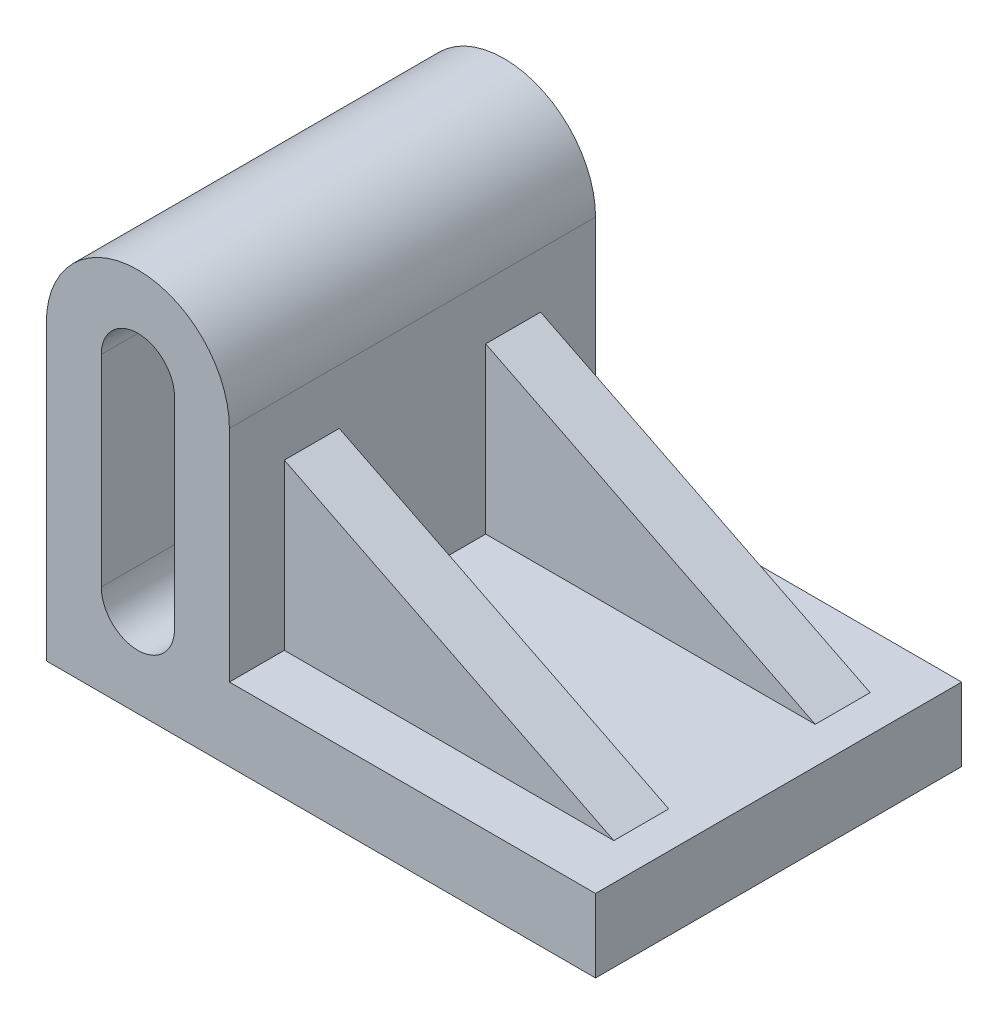
ISO-10303-21;
HEADER;
FILE_DESCRIPTION(('STEP AP214'),'2;1');
FILE_NAME('part.step','',(''),(''),'','','');
FILE_SCHEMA(('AUTOMOTIVE_DESIGN { 1 0 10303 214 1 1 1 1 }'));
ENDSEC;
DATA;
#1=APPLICATION_CONTEXT('core data for automotive mechanical design processes');
#2=APPLICATION_PROTOCOL_DEFINITION('international standard','automotive_design',2000,#1);
#3=PRODUCT_CONTEXT('',#1,'mechanical');
#4=PRODUCT('Part','Part','',(#3));
#5=PRODUCT_RELATED_PRODUCT_CATEGORY('part','',(#4));
#6=PRODUCT_DEFINITION_FORMATION('','',#4);
#7=PRODUCT_DEFINITION_CONTEXT('part definition',#1,'design');
#8=PRODUCT_DEFINITION('design','',#6,#7);
#9=PRODUCT_DEFINITION_SHAPE('','',#8);
#10=(LENGTH_UNIT() NAMED_UNIT(*) SI_UNIT(.MILLI.,.METRE.));
#11=(NAMED_UNIT(*) PLANE_ANGLE_UNIT() SI_UNIT($,.RADIAN.));
#12=(NAMED_UNIT(*) SI_UNIT($,.STERADIAN.) SOLID_ANGLE_UNIT());
#13=UNCERTAINTY_MEASURE_WITH_UNIT(LENGTH_MEASURE(1.E-05),#10,'distance_accuracy_value','');
#14=(GEOMETRIC_REPRESENTATION_CONTEXT(3) GLOBAL_UNCERTAINTY_ASSIGNED_CONTEXT((#13)) GLOBAL_UNIT_ASSIGNED_CONTEXT((#10,
#11,#12)) REPRESENTATION_CONTEXT('',''));
#15=CARTESIAN_POINT('',(0.,0.,0.));
#16=DIRECTION('',(0.,0.,1.));
#17=DIRECTION('',(1.,0.,0.));
#18=AXIS2_PLACEMENT_3D('',#15,#16,#17);
#19=CARTESIAN_POINT('',(25.,80.,50.));
#20=DIRECTION('',(0.,0.,-1.));
#21=DIRECTION('',(-1.,0.,0.));
#22=AXIS2_PLACEMENT_3D('',#19,#20,#21);
#23=CYLINDRICAL_SURFACE('',#22,25.);
#24=CARTESIAN_POINT('',(25.,80.,-50.));
#25=DIRECTION('',(0.,0.,1.));
#26=DIRECTION('',(1.,0.,0.));
#27=AXIS2_PLACEMENT_3D('',#24,#25,#26);
#28=CIRCLE('',#27,25.);
#29=CARTESIAN_POINT('',(0.,80.,-50.));
#30=VERTEX_POINT('',#29);
#31=CARTESIAN_POINT('',(50.,80.,-50.));
#32=VERTEX_POINT('',#31);
#33=EDGE_CURVE('E245',#30,#32,#28,.F.);
#34=ORIENTED_EDGE('',*,*,#33,.F.);
#35=DIRECTION('',(0.,0.,-1.));
#36=VECTOR('',#35,1.);
#37=CARTESIAN_POINT('',(0.,80.,50.));
#38=LINE('',#37,#36);
#39=CARTESIAN_POINT('',(0.,80.,50.));
#40=VERTEX_POINT('',#39);
#41=EDGE_CURVE('E11',#40,#30,#38,.T.);
#42=ORIENTED_EDGE('',*,*,#41,.F.);
#43=CARTESIAN_POINT('',(25.,80.,50.));
#44=DIRECTION('',(0.,0.,1.));
#45=DIRECTION('',(1.,0.,0.));
#46=AXIS2_PLACEMENT_3D('',#43,#44,#45);
#47=CIRCLE('',#46,25.);
#48=CARTESIAN_POINT('',(50.,80.,50.));
#49=VERTEX_POINT('',#48);
#50=EDGE_CURVE('E215',#40,#49,#47,.F.);
#51=ORIENTED_EDGE('',*,*,#50,.T.);
#52=DIRECTION('',(0.,0.,-1.));
#53=VECTOR('',#52,1.);
#54=CARTESIAN_POINT('',(50.,80.,50.));
#55=LINE('',#54,#53);
#56=EDGE_CURVE('E262',#49,#32,#55,.T.);
#57=ORIENTED_EDGE('',*,*,#56,.T.);
#58=EDGE_LOOP('',(#34,#42,#51,#57));
#59=FACE_BOUND('',#58,.T.);
#60=ADVANCED_FACE('F41',(#59),#23,.T.);
#61=CARTESIAN_POINT('',(0.,0.,50.));
#62=DIRECTION('',(-1.,0.,0.));
#63=DIRECTION('',(0.,0.,1.));
#64=AXIS2_PLACEMENT_3D('',#61,#62,#63);
#65=PLANE('',#64);
#66=DIRECTION('',(0.,1.,0.));
#67=VECTOR('',#66,1.);
#68=CARTESIAN_POINT('',(0.,0.,-50.));
#69=LINE('',#68,#67);
#70=CARTESIAN_POINT('',(0.,0.,-50.));
#71=VERTEX_POINT('',#70);
#72=EDGE_CURVE('E248',#71,#30,#69,.T.);
#73=ORIENTED_EDGE('',*,*,#72,.F.);
#74=DIRECTION('',(0.,0.,-1.));
#75=VECTOR('',#74,1.);
#76=CARTESIAN_POINT('',(0.,0.,50.));
#77=LINE('',#76,#75);
#78=CARTESIAN_POINT('',(0.,0.,50.));
#79=VERTEX_POINT('',#78);
#80=EDGE_CURVE('E50',#79,#71,#77,.T.);
#81=ORIENTED_EDGE('',*,*,#80,.F.);
#82=DIRECTION('',(0.,1.,0.));
#83=VECTOR('',#82,1.);
#84=CARTESIAN_POINT('',(0.,0.,50.));
#85=LINE('',#84,#83);
#86=EDGE_CURVE('E218',#79,#40,#85,.T.);
#87=ORIENTED_EDGE('',*,*,#86,.T.);
#88=ORIENTED_EDGE('',*,*,#41,.T.);
#89=EDGE_LOOP('',(#73,#81,#87,#88));
#90=FACE_BOUND('',#89,.T.);
#91=ADVANCED_FACE('F309',(#90),#65,.T.);
#92=CARTESIAN_POINT('',(0.,0.,50.));
#93=DIRECTION('',(0.,-1.,0.));
#94=DIRECTION('',(1.,0.,0.));
#95=AXIS2_PLACEMENT_3D('',#92,#93,#94);
#96=PLANE('',#95);
#97=DIRECTION('',(-1.,0.,0.));
#98=VECTOR('',#97,1.);
#99=CARTESIAN_POINT('',(0.,0.,-50.));
#100=LINE('',#99,#98);
#101=CARTESIAN_POINT('',(150.,0.,-50.));
#102=VERTEX_POINT('',#101);
#103=EDGE_CURVE('E251',#102,#71,#100,.T.);
#104=ORIENTED_EDGE('',*,*,#103,.F.);
#105=DIRECTION('',(0.,0.,-1.));
#106=VECTOR('',#105,1.);
#107=CARTESIAN_POINT('',(150.,0.,50.));
#108=LINE('',#107,#106);
#109=CARTESIAN_POINT('',(150.,0.,50.));
#110=VERTEX_POINT('',#109);
#111=EDGE_CURVE('E270',#110,#102,#108,.T.);
#112=ORIENTED_EDGE('',*,*,#111,.F.);
#113=DIRECTION('',(-1.,0.,0.));
#114=VECTOR('',#113,1.);
#115=CARTESIAN_POINT('',(0.,0.,50.));
#116=LINE('',#115,#114);
#117=EDGE_CURVE('E221',#110,#79,#116,.T.);
#118=ORIENTED_EDGE('',*,*,#117,.T.);
#119=ORIENTED_EDGE('',*,*,#80,.T.);
#120=EDGE_LOOP('',(#104,#112,#118,#119));
#121=FACE_BOUND('',#120,.T.);
#122=ADVANCED_FACE('F313',(#121),#96,.T.);
#123=CARTESIAN_POINT('',(150.,0.,50.));
#124=DIRECTION('',(1.,0.,0.));
#125=DIRECTION('',(0.,0.,-1.));
#126=AXIS2_PLACEMENT_3D('',#123,#124,#125);
#127=PLANE('',#126);
#128=DIRECTION('',(0.,-1.,0.));
#129=VECTOR('',#128,1.);
#130=CARTESIAN_POINT('',(150.,0.,-50.));
#131=LINE('',#130,#129);
#132=CARTESIAN_POINT('',(150.,20.,-50.));
#133=VERTEX_POINT('',#132);
#134=EDGE_CURVE('E254',#133,#102,#131,.T.);
#135=ORIENTED_EDGE('',*,*,#134,.F.);
#136=DIRECTION('',(0.,0.,-1.));
#137=VECTOR('',#136,1.);
#138=CARTESIAN_POINT('',(150.,20.,50.));
#139=LINE('',#138,#137);
#140=CARTESIAN_POINT('',(150.,20.,50.));
#141=VERTEX_POINT('',#140);
#142=EDGE_CURVE('E267',#141,#133,#139,.T.);
#143=ORIENTED_EDGE('',*,*,#142,.F.);
#144=DIRECTION('',(0.,-1.,0.));
#145=VECTOR('',#144,1.);
#146=CARTESIAN_POINT('',(150.,0.,50.));
#147=LINE('',#146,#145);
#148=EDGE_CURVE('E224',#141,#110,#147,.T.);
#149=ORIENTED_EDGE('',*,*,#148,.T.);
#150=ORIENTED_EDGE('',*,*,#111,.T.);
#151=EDGE_LOOP('',(#135,#143,#149,#150));
#152=FACE_BOUND('',#151,.T.);
#153=ADVANCED_FACE('F317',(#152),#127,.T.);
#154=CARTESIAN_POINT('',(0.,20.,50.));
#155=DIRECTION('',(0.,1.,0.));
#156=DIRECTION('',(0.,0.,1.));
#157=AXIS2_PLACEMENT_3D('',#154,#155,#156);
#158=PLANE('',#157);
#159=DIRECTION('',(1.,0.,0.));
#160=VECTOR('',#159,1.);
#161=CARTESIAN_POINT('',(0.,20.,-35.));
#162=LINE('',#161,#160);
#163=CARTESIAN_POINT('',(50.,20.,-35.));
#164=VERTEX_POINT('',#163);
#165=CARTESIAN_POINT('',(140.,20.,-35.));
#166=VERTEX_POINT('',#165);
#167=EDGE_CURVE('E159',#164,#166,#162,.T.);
#168=ORIENTED_EDGE('',*,*,#167,.T.);
#169=DIRECTION('',(0.,0.,1.));
#170=VECTOR('',#169,1.);
#171=CARTESIAN_POINT('',(140.,20.,-35.));
#172=LINE('',#171,#170);
#173=CARTESIAN_POINT('',(140.,20.,-20.));
#174=VERTEX_POINT('',#173);
#175=EDGE_CURVE('E167',#166,#174,#172,.T.);
#176=ORIENTED_EDGE('',*,*,#175,.T.);
#177=DIRECTION('',(1.,0.,0.));
#178=VECTOR('',#177,1.);
#179=CARTESIAN_POINT('',(0.,20.,-20.));
#180=LINE('',#179,#178);
#181=CARTESIAN_POINT('',(50.,20.,-20.));
#182=VERTEX_POINT('',#181);
#183=EDGE_CURVE('E182',#182,#174,#180,.T.);
#184=ORIENTED_EDGE('',*,*,#183,.F.);
#185=DIRECTION('',(0.,0.,-1.));
#186=VECTOR('',#185,1.);
#187=CARTESIAN_POINT('',(50.,20.,50.));
#188=LINE('',#187,#186);
#189=CARTESIAN_POINT('',(50.,20.,20.));
#190=VERTEX_POINT('',#189);
#191=EDGE_CURVE('E268',#190,#182,#188,.T.);
#192=ORIENTED_EDGE('',*,*,#191,.F.);
#193=DIRECTION('',(1.,0.,0.));
#194=VECTOR('',#193,1.);
#195=CARTESIAN_POINT('',(0.,20.,20.));
#196=LINE('',#195,#194);
#197=CARTESIAN_POINT('',(140.,20.,20.));
#198=VERTEX_POINT('',#197);
#199=EDGE_CURVE('E66',#190,#198,#196,.T.);
#200=ORIENTED_EDGE('',*,*,#199,.T.);
#201=DIRECTION('',(0.,0.,-1.));
#202=VECTOR('',#201,1.);
#203=CARTESIAN_POINT('',(140.,20.,35.));
#204=LINE('',#203,#202);
#205=CARTESIAN_POINT('',(140.,20.,35.));
#206=VERTEX_POINT('',#205);
#207=EDGE_CURVE('E193',#206,#198,#204,.T.);
#208=ORIENTED_EDGE('',*,*,#207,.F.);
#209=DIRECTION('',(1.,0.,0.));
#210=VECTOR('',#209,1.);
#211=CARTESIAN_POINT('',(0.,20.,35.));
#212=LINE('',#211,#210);
#213=CARTESIAN_POINT('',(50.,20.,35.));
#214=VERTEX_POINT('',#213);
#215=EDGE_CURVE('E191',#214,#206,#212,.T.);
#216=ORIENTED_EDGE('',*,*,#215,.F.);
#217=CARTESIAN_POINT('',(50.,20.,50.));
#218=VERTEX_POINT('',#217);
#219=EDGE_CURVE('E264',#218,#214,#188,.T.);
#220=ORIENTED_EDGE('',*,*,#219,.F.);
#221=DIRECTION('',(1.,0.,0.));
#222=VECTOR('',#221,1.);
#223=CARTESIAN_POINT('',(0.,20.,50.));
#224=LINE('',#223,#222);
#225=EDGE_CURVE('E227',#218,#141,#224,.T.);
#226=ORIENTED_EDGE('',*,*,#225,.T.);
#227=ORIENTED_EDGE('',*,*,#142,.T.);
#228=DIRECTION('',(1.,0.,0.));
#229=VECTOR('',#228,1.);
#230=CARTESIAN_POINT('',(0.,20.,-50.));
#231=LINE('',#230,#229);
#232=CARTESIAN_POINT('',(50.,20.,-50.));
#233=VERTEX_POINT('',#232);
#234=EDGE_CURVE('E257',#233,#133,#231,.T.);
#235=ORIENTED_EDGE('',*,*,#234,.F.);
#236=EDGE_CURVE('E177',#164,#233,#188,.T.);
#237=ORIENTED_EDGE('',*,*,#236,.F.);
#238=EDGE_LOOP('',(#168,#176,#184,#192,#200,#208,#216,#220,#226,#227,#235,#237));
#239=FACE_BOUND('',#238,.T.);
#240=ADVANCED_FACE('F175',(#239),#158,.T.);
#241=CARTESIAN_POINT('',(25.,25.,50.));
#242=DIRECTION('',(0.,0.,-1.));
#243=DIRECTION('',(-1.,0.,0.));
#244=AXIS2_PLACEMENT_3D('',#241,#242,#243);
#245=CYLINDRICAL_SURFACE('',#244,10.);
#246=CARTESIAN_POINT('',(25.,25.,-50.));
#247=DIRECTION('',(0.,0.,1.));
#248=DIRECTION('',(1.,0.,0.));
#249=AXIS2_PLACEMENT_3D('',#246,#247,#248);
#250=CIRCLE('',#249,10.);
#251=CARTESIAN_POINT('',(15.,25.,-50.));
#252=VERTEX_POINT('',#251);
#253=CARTESIAN_POINT('',(35.,25.,-50.));
#254=VERTEX_POINT('',#253);
#255=EDGE_CURVE('E202',#252,#254,#250,.T.);
#256=ORIENTED_EDGE('',*,*,#255,.F.);
#257=DIRECTION('',(0.,0.,-1.));
#258=VECTOR('',#257,1.);
#259=CARTESIAN_POINT('',(15.,25.,50.));
#260=LINE('',#259,#258);
#261=CARTESIAN_POINT('',(15.,25.,50.));
#262=VERTEX_POINT('',#261);
#263=EDGE_CURVE('E45',#262,#252,#260,.T.);
#264=ORIENTED_EDGE('',*,*,#263,.F.);
#265=CARTESIAN_POINT('',(25.,25.,50.));
#266=DIRECTION('',(0.,0.,1.));
#267=DIRECTION('',(1.,0.,0.));
#268=AXIS2_PLACEMENT_3D('',#265,#266,#267);
#269=CIRCLE('',#268,10.);
#270=CARTESIAN_POINT('',(35.,25.,50.));
#271=VERTEX_POINT('',#270);
#272=EDGE_CURVE('E203',#262,#271,#269,.T.);
#273=ORIENTED_EDGE('',*,*,#272,.T.);
#274=DIRECTION('',(0.,0.,-1.));
#275=VECTOR('',#274,1.);
#276=CARTESIAN_POINT('',(35.,25.,50.));
#277=LINE('',#276,#275);
#278=EDGE_CURVE('E233',#271,#254,#277,.T.);
#279=ORIENTED_EDGE('',*,*,#278,.T.);
#280=EDGE_LOOP('',(#256,#264,#273,#279));
#281=FACE_BOUND('',#280,.T.);
#282=ADVANCED_FACE('F43',(#281),#245,.F.);
#283=CARTESIAN_POINT('',(15.,0.,50.));
#284=DIRECTION('',(1.,0.,0.));
#285=DIRECTION('',(0.,0.,-1.));
#286=AXIS2_PLACEMENT_3D('',#283,#284,#285);
#287=PLANE('',#286);
#288=DIRECTION('',(0.,-1.,0.));
#289=VECTOR('',#288,1.);
#290=CARTESIAN_POINT('',(15.,0.,-50.));
#291=LINE('',#290,#289);
#292=CARTESIAN_POINT('',(15.,80.,-50.));
#293=VERTEX_POINT('',#292);
#294=EDGE_CURVE('E236',#293,#252,#291,.T.);
#295=ORIENTED_EDGE('',*,*,#294,.F.);
#296=DIRECTION('',(0.,0.,-1.));
#297=VECTOR('',#296,1.);
#298=CARTESIAN_POINT('',(15.,80.,50.));
#299=LINE('',#298,#297);
#300=CARTESIAN_POINT('',(15.,80.,50.));
#301=VERTEX_POINT('',#300);
#302=EDGE_CURVE('E275',#301,#293,#299,.T.);
#303=ORIENTED_EDGE('',*,*,#302,.F.);
#304=DIRECTION('',(0.,-1.,0.));
#305=VECTOR('',#304,1.);
#306=CARTESIAN_POINT('',(15.,0.,50.));
#307=LINE('',#306,#305);
#308=EDGE_CURVE('E206',#301,#262,#307,.T.);
#309=ORIENTED_EDGE('',*,*,#308,.T.);
#310=ORIENTED_EDGE('',*,*,#263,.T.);
#311=EDGE_LOOP('',(#295,#303,#309,#310));
#312=FACE_BOUND('',#311,.T.);
#313=ADVANCED_FACE('F281',(#312),#287,.T.);
#314=CARTESIAN_POINT('',(25.,80.,50.));
#315=DIRECTION('',(0.,0.,-1.));
#316=DIRECTION('',(-1.,0.,0.));
#317=AXIS2_PLACEMENT_3D('',#314,#315,#316);
#318=CYLINDRICAL_SURFACE('',#317,10.);
#319=CARTESIAN_POINT('',(25.,80.,-50.));
#320=DIRECTION('',(0.,0.,1.));
#321=DIRECTION('',(1.,0.,0.));
#322=AXIS2_PLACEMENT_3D('',#319,#320,#321);
#323=CIRCLE('',#322,10.);
#324=CARTESIAN_POINT('',(35.,80.,-50.));
#325=VERTEX_POINT('',#324);
#326=EDGE_CURVE('E239',#325,#293,#323,.T.);
#327=ORIENTED_EDGE('',*,*,#326,.F.);
#328=DIRECTION('',(0.,0.,-1.));
#329=VECTOR('',#328,1.);
#330=CARTESIAN_POINT('',(35.,80.,50.));
#331=LINE('',#330,#329);
#332=CARTESIAN_POINT('',(35.,80.,50.));
#333=VERTEX_POINT('',#332);
#334=EDGE_CURVE('E274',#333,#325,#331,.T.);
#335=ORIENTED_EDGE('',*,*,#334,.F.);
#336=CARTESIAN_POINT('',(25.,80.,50.));
#337=DIRECTION('',(0.,0.,1.));
#338=DIRECTION('',(1.,0.,0.));
#339=AXIS2_PLACEMENT_3D('',#336,#337,#338);
#340=CIRCLE('',#339,10.);
#341=EDGE_CURVE('E210',#333,#301,#340,.T.);
#342=ORIENTED_EDGE('',*,*,#341,.T.);
#343=ORIENTED_EDGE('',*,*,#302,.T.);
#344=EDGE_LOOP('',(#327,#335,#342,#343));
#345=FACE_BOUND('',#344,.T.);
#346=ADVANCED_FACE('F290',(#345),#318,.F.);
#347=CARTESIAN_POINT('',(35.,0.,50.));
#348=DIRECTION('',(1.,0.,0.));
#349=DIRECTION('',(0.,1.,0.));
#350=AXIS2_PLACEMENT_3D('',#347,#348,#349);
#351=PLANE('',#350);
#352=DIRECTION('',(0.,-1.,0.));
#353=VECTOR('',#352,1.);
#354=CARTESIAN_POINT('',(35.,0.,-50.));
#355=LINE('',#354,#353);
#356=EDGE_CURVE('E242',#325,#254,#355,.T.);
#357=ORIENTED_EDGE('',*,*,#356,.T.);
#358=ORIENTED_EDGE('',*,*,#278,.F.);
#359=DIRECTION('',(0.,-1.,0.));
#360=VECTOR('',#359,1.);
#361=CARTESIAN_POINT('',(35.,0.,50.));
#362=LINE('',#361,#360);
#363=EDGE_CURVE('E213',#333,#271,#362,.T.);
#364=ORIENTED_EDGE('',*,*,#363,.F.);
#365=ORIENTED_EDGE('',*,*,#334,.T.);
#366=EDGE_LOOP('',(#357,#358,#364,#365));
#367=FACE_BOUND('',#366,.T.);
#368=ADVANCED_FACE('F294',(#367),#351,.F.);
#369=CARTESIAN_POINT('',(50.,0.,50.));
#370=DIRECTION('',(1.,0.,0.));
#371=DIRECTION('',(0.,1.,0.));
#372=AXIS2_PLACEMENT_3D('',#369,#370,#371);
#373=PLANE('',#372);
#374=DIRECTION('',(0.,-1.,0.));
#375=VECTOR('',#374,1.);
#376=CARTESIAN_POINT('',(50.,0.,-35.));
#377=LINE('',#376,#375);
#378=CARTESIAN_POINT('',(50.,65.,-35.));
#379=VERTEX_POINT('',#378);
#380=EDGE_CURVE('E161',#379,#164,#377,.T.);
#381=ORIENTED_EDGE('',*,*,#380,.T.);
#382=ORIENTED_EDGE('',*,*,#236,.T.);
#383=DIRECTION('',(0.,-1.,0.));
#384=VECTOR('',#383,1.);
#385=CARTESIAN_POINT('',(50.,0.,-50.));
#386=LINE('',#385,#384);
#387=EDGE_CURVE('E207',#32,#233,#386,.T.);
#388=ORIENTED_EDGE('',*,*,#387,.F.);
#389=ORIENTED_EDGE('',*,*,#56,.F.);
#390=DIRECTION('',(0.,-1.,0.));
#391=VECTOR('',#390,1.);
#392=CARTESIAN_POINT('',(50.,0.,50.));
#393=LINE('',#392,#391);
#394=EDGE_CURVE('E230',#49,#218,#393,.T.);
#395=ORIENTED_EDGE('',*,*,#394,.T.);
#396=ORIENTED_EDGE('',*,*,#219,.T.);
#397=DIRECTION('',(0.,-1.,0.));
#398=VECTOR('',#397,1.);
#399=CARTESIAN_POINT('',(50.,0.,35.));
#400=LINE('',#399,#398);
#401=CARTESIAN_POINT('',(50.,65.,35.));
#402=VERTEX_POINT('',#401);
#403=EDGE_CURVE('E189',#402,#214,#400,.T.);
#404=ORIENTED_EDGE('',*,*,#403,.F.);
#405=DIRECTION('',(0.,0.,-1.));
#406=VECTOR('',#405,1.);
#407=CARTESIAN_POINT('',(50.,65.,35.));
#408=LINE('',#407,#406);
#409=CARTESIAN_POINT('',(50.,65.,20.));
#410=VERTEX_POINT('',#409);
#411=EDGE_CURVE('E199',#402,#410,#408,.T.);
#412=ORIENTED_EDGE('',*,*,#411,.T.);
#413=DIRECTION('',(0.,-1.,0.));
#414=VECTOR('',#413,1.);
#415=CARTESIAN_POINT('',(50.,0.,20.));
#416=LINE('',#415,#414);
#417=EDGE_CURVE('E195',#410,#190,#416,.T.);
#418=ORIENTED_EDGE('',*,*,#417,.T.);
#419=ORIENTED_EDGE('',*,*,#191,.T.);
#420=DIRECTION('',(0.,-1.,0.));
#421=VECTOR('',#420,1.);
#422=CARTESIAN_POINT('',(50.,0.,-20.));
#423=LINE('',#422,#421);
#424=CARTESIAN_POINT('',(50.,65.,-20.));
#425=VERTEX_POINT('',#424);
#426=EDGE_CURVE('E164',#425,#182,#423,.T.);
#427=ORIENTED_EDGE('',*,*,#426,.F.);
#428=DIRECTION('',(0.,0.,1.));
#429=VECTOR('',#428,1.);
#430=CARTESIAN_POINT('',(50.,65.,-35.));
#431=LINE('',#430,#429);
#432=EDGE_CURVE('E172',#379,#425,#431,.T.);
#433=ORIENTED_EDGE('',*,*,#432,.F.);
#434=EDGE_LOOP('',(#381,#382,#388,#389,#395,#396,#404,#412,#418,#419,#427,#433));
#435=FACE_BOUND('',#434,.T.);
#436=ADVANCED_FACE('F299',(#435),#373,.T.);
#437=CARTESIAN_POINT('',(0.,0.,50.));
#438=DIRECTION('',(0.,0.,1.));
#439=DIRECTION('',(1.,0.,0.));
#440=AXIS2_PLACEMENT_3D('',#437,#438,#439);
#441=PLANE('',#440);
#442=ORIENTED_EDGE('',*,*,#272,.F.);
#443=ORIENTED_EDGE('',*,*,#308,.F.);
#444=ORIENTED_EDGE('',*,*,#341,.F.);
#445=ORIENTED_EDGE('',*,*,#363,.T.);
#446=EDGE_LOOP('',(#442,#443,#444,#445));
#447=FACE_BOUND('',#446,.T.);
#448=ORIENTED_EDGE('',*,*,#50,.F.);
#449=ORIENTED_EDGE('',*,*,#86,.F.);
#450=ORIENTED_EDGE('',*,*,#117,.F.);
#451=ORIENTED_EDGE('',*,*,#148,.F.);
#452=ORIENTED_EDGE('',*,*,#225,.F.);
#453=ORIENTED_EDGE('',*,*,#394,.F.);
#454=EDGE_LOOP('',(#448,#449,#450,#451,#452,#453));
#455=FACE_BOUND('',#454,.T.);
#456=ADVANCED_FACE('F296',(#447,#455),#441,.T.);
#457=CARTESIAN_POINT('',(0.,0.,-50.));
#458=DIRECTION('',(0.,0.,1.));
#459=DIRECTION('',(1.,0.,0.));
#460=AXIS2_PLACEMENT_3D('',#457,#458,#459);
#461=PLANE('',#460);
#462=ORIENTED_EDGE('',*,*,#255,.T.);
#463=ORIENTED_EDGE('',*,*,#356,.F.);
#464=ORIENTED_EDGE('',*,*,#326,.T.);
#465=ORIENTED_EDGE('',*,*,#294,.T.);
#466=EDGE_LOOP('',(#462,#463,#464,#465));
#467=FACE_BOUND('',#466,.T.);
#468=ORIENTED_EDGE('',*,*,#33,.T.);
#469=ORIENTED_EDGE('',*,*,#387,.T.);
#470=ORIENTED_EDGE('',*,*,#234,.T.);
#471=ORIENTED_EDGE('',*,*,#134,.T.);
#472=ORIENTED_EDGE('',*,*,#103,.T.);
#473=ORIENTED_EDGE('',*,*,#72,.T.);
#474=EDGE_LOOP('',(#468,#469,#470,#471,#472,#473));
#475=FACE_BOUND('',#474,.T.);
#476=ADVANCED_FACE('F288',(#467,#475),#461,.F.);
#477=CARTESIAN_POINT('',(36.,72.,35.));
#478=DIRECTION('',(0.447213595499958,0.894427190999916,0.));
#479=DIRECTION('',(-0.894427190999916,0.447213595499958,0.));
#480=AXIS2_PLACEMENT_3D('',#477,#478,#479);
#481=PLANE('',#480);
#482=DIRECTION('',(0.894427190999916,-0.447213595499958,0.));
#483=VECTOR('',#482,1.);
#484=CARTESIAN_POINT('',(36.,72.,20.));
#485=LINE('',#484,#483);
#486=EDGE_CURVE('E171',#410,#198,#485,.T.);
#487=ORIENTED_EDGE('',*,*,#486,.F.);
#488=ORIENTED_EDGE('',*,*,#411,.F.);
#489=DIRECTION('',(0.894427190999916,-0.447213595499958,0.));
#490=VECTOR('',#489,1.);
#491=CARTESIAN_POINT('',(36.,72.,35.));
#492=LINE('',#491,#490);
#493=EDGE_CURVE('E186',#402,#206,#492,.T.);
#494=ORIENTED_EDGE('',*,*,#493,.T.);
#495=ORIENTED_EDGE('',*,*,#207,.T.);
#496=EDGE_LOOP('',(#487,#488,#494,#495));
#497=FACE_BOUND('',#496,.T.);
#498=ADVANCED_FACE('F323',(#497),#481,.T.);
#499=CARTESIAN_POINT('',(0.,0.,35.));
#500=DIRECTION('',(0.,0.,1.));
#501=DIRECTION('',(1.,0.,0.));
#502=AXIS2_PLACEMENT_3D('',#499,#500,#501);
#503=PLANE('',#502);
#504=ORIENTED_EDGE('',*,*,#493,.F.);
#505=ORIENTED_EDGE('',*,*,#403,.T.);
#506=ORIENTED_EDGE('',*,*,#215,.T.);
#507=EDGE_LOOP('',(#504,#505,#506));
#508=FACE_BOUND('',#507,.T.);
#509=ADVANCED_FACE('F328',(#508),#503,.T.);
#510=CARTESIAN_POINT('',(0.,0.,20.));
#511=DIRECTION('',(0.,0.,1.));
#512=DIRECTION('',(1.,0.,0.));
#513=AXIS2_PLACEMENT_3D('',#510,#511,#512);
#514=PLANE('',#513);
#515=ORIENTED_EDGE('',*,*,#486,.T.);
#516=ORIENTED_EDGE('',*,*,#199,.F.);
#517=ORIENTED_EDGE('',*,*,#417,.F.);
#518=EDGE_LOOP('',(#515,#516,#517));
#519=FACE_BOUND('',#518,.T.);
#520=ADVANCED_FACE('F424',(#519),#514,.F.);
#521=CARTESIAN_POINT('',(36.,72.,-35.));
#522=DIRECTION('',(-0.447213595499958,-0.894427190999916,0.));
#523=DIRECTION('',(0.894427190999916,-0.447213595499958,0.));
#524=AXIS2_PLACEMENT_3D('',#521,#522,#523);
#525=PLANE('',#524);
#526=DIRECTION('',(0.894427190999916,-0.447213595499958,0.));
#527=VECTOR('',#526,1.);
#528=CARTESIAN_POINT('',(36.,72.,-20.));
#529=LINE('',#528,#527);
#530=EDGE_CURVE('E58',#425,#174,#529,.T.);
#531=ORIENTED_EDGE('',*,*,#530,.T.);
#532=ORIENTED_EDGE('',*,*,#175,.F.);
#533=DIRECTION('',(0.894427190999916,-0.447213595499958,0.));
#534=VECTOR('',#533,1.);
#535=CARTESIAN_POINT('',(36.,72.,-35.));
#536=LINE('',#535,#534);
#537=EDGE_CURVE('E155',#379,#166,#536,.T.);
#538=ORIENTED_EDGE('',*,*,#537,.F.);
#539=ORIENTED_EDGE('',*,*,#432,.T.);
#540=EDGE_LOOP('',(#531,#532,#538,#539));
#541=FACE_BOUND('',#540,.T.);
#542=ADVANCED_FACE('F168',(#541),#525,.F.);
#543=CARTESIAN_POINT('',(0.,0.,-35.));
#544=DIRECTION('',(0.,0.,-1.));
#545=DIRECTION('',(1.,0.,0.));
#546=AXIS2_PLACEMENT_3D('',#543,#544,#545);
#547=PLANE('',#546);
#548=ORIENTED_EDGE('',*,*,#537,.T.);
#549=ORIENTED_EDGE('',*,*,#167,.F.);
#550=ORIENTED_EDGE('',*,*,#380,.F.);
#551=EDGE_LOOP('',(#548,#549,#550));
#552=FACE_BOUND('',#551,.T.);
#553=ADVANCED_FACE('F157',(#552),#547,.T.);
#554=CARTESIAN_POINT('',(0.,0.,-20.));
#555=DIRECTION('',(0.,0.,-1.));
#556=DIRECTION('',(1.,0.,0.));
#557=AXIS2_PLACEMENT_3D('',#554,#555,#556);
#558=PLANE('',#557);
#559=ORIENTED_EDGE('',*,*,#530,.F.);
#560=ORIENTED_EDGE('',*,*,#426,.T.);
#561=ORIENTED_EDGE('',*,*,#183,.T.);
#562=EDGE_LOOP('',(#559,#560,#561));
#563=FACE_BOUND('',#562,.T.);
#564=ADVANCED_FACE('F448',(#563),#558,.F.);
#565=CLOSED_SHELL('',(#60,#91,#122,#153,#240,#282,#313,#346,#368,#436,#456,#476,#498,#509,#520,
#542,#553,#564));
#566=MANIFOLD_SOLID_BREP('B2',#565);
#567=ADVANCED_BREP_SHAPE_REPRESENTATION('',(#18,#566),#14);
#568=SHAPE_DEFINITION_REPRESENTATION(#9,#567);
ENDSEC;
END-ISO-10303-21;
